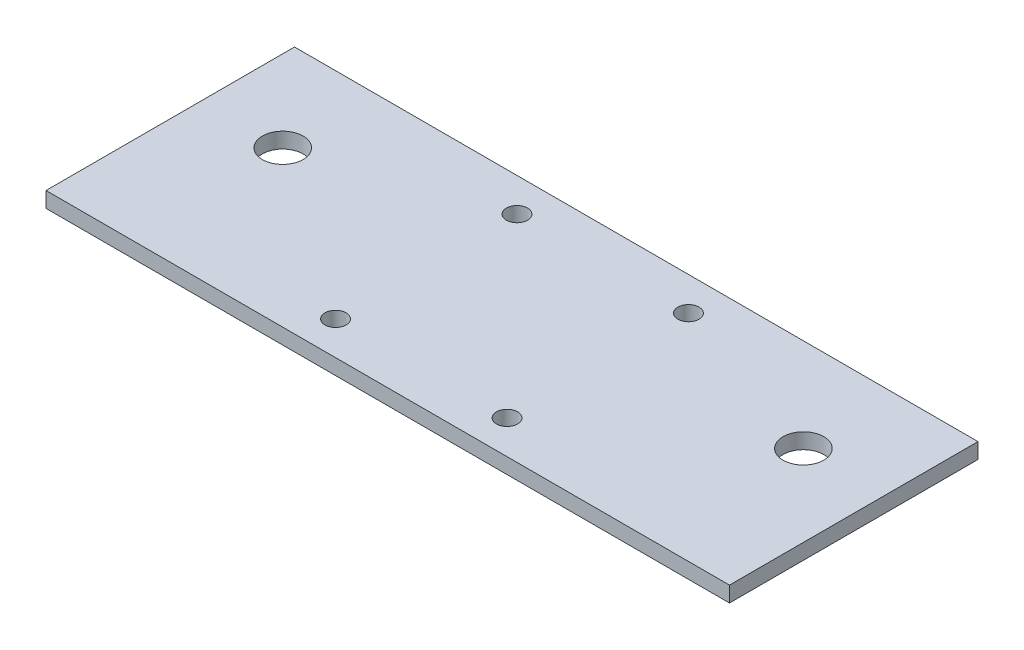
ISO-10303-21;
HEADER;
FILE_DESCRIPTION(('STEP AP214'),'2;1');
FILE_NAME('part.step','',(''),(''),'','','');
FILE_SCHEMA(('AUTOMOTIVE_DESIGN { 1 0 10303 214 1 1 1 1 }'));
ENDSEC;
DATA;
#1=APPLICATION_CONTEXT('core data for automotive mechanical design processes');
#2=APPLICATION_PROTOCOL_DEFINITION('international standard','automotive_design',2000,#1);
#3=PRODUCT_CONTEXT('',#1,'mechanical');
#4=PRODUCT('Part','Part','',(#3));
#5=PRODUCT_RELATED_PRODUCT_CATEGORY('part','',(#4));
#6=PRODUCT_DEFINITION_FORMATION('','',#4);
#7=PRODUCT_DEFINITION_CONTEXT('part definition',#1,'design');
#8=PRODUCT_DEFINITION('design','',#6,#7);
#9=PRODUCT_DEFINITION_SHAPE('','',#8);
#10=(LENGTH_UNIT() NAMED_UNIT(*) SI_UNIT(.MILLI.,.METRE.));
#11=(NAMED_UNIT(*) PLANE_ANGLE_UNIT() SI_UNIT($,.RADIAN.));
#12=(NAMED_UNIT(*) SI_UNIT($,.STERADIAN.) SOLID_ANGLE_UNIT());
#13=UNCERTAINTY_MEASURE_WITH_UNIT(LENGTH_MEASURE(1.E-05),#10,'distance_accuracy_value','');
#14=(GEOMETRIC_REPRESENTATION_CONTEXT(3) GLOBAL_UNCERTAINTY_ASSIGNED_CONTEXT((#13)) GLOBAL_UNIT_ASSIGNED_CONTEXT((#10,
#11,#12)) REPRESENTATION_CONTEXT('',''));
#15=CARTESIAN_POINT('',(0.,0.,0.));
#16=DIRECTION('',(0.,0.,1.));
#17=DIRECTION('',(1.,0.,0.));
#18=AXIS2_PLACEMENT_3D('',#15,#16,#17);
#19=CARTESIAN_POINT('',(0.,3.175,0.));
#20=DIRECTION('',(0.,1.,0.));
#21=DIRECTION('',(0.,0.,1.));
#22=AXIS2_PLACEMENT_3D('',#19,#20,#21);
#23=PLANE('',#22);
#24=CARTESIAN_POINT('',(-35.687,3.175,12.192));
#25=DIRECTION('',(0.,1.,0.));
#26=DIRECTION('',(0.,0.,1.));
#27=AXIS2_PLACEMENT_3D('',#24,#25,#26);
#28=CIRCLE('',#27,4.1656);
#29=CARTESIAN_POINT('',(-35.687,3.175,16.3576));
#30=VERTEX_POINT('',#29);
#31=EDGE_CURVE('E137',#30,#30,#28,.T.);
#32=ORIENTED_EDGE('',*,*,#31,.F.);
#33=EDGE_LOOP('',(#32));
#34=FACE_BOUND('',#33,.T.);
#35=CARTESIAN_POINT('',(0.,3.175,37.084));
#36=DIRECTION('',(0.,1.,0.));
#37=DIRECTION('',(0.,0.,1.));
#38=AXIS2_PLACEMENT_3D('',#35,#36,#37);
#39=CIRCLE('',#38,2.159);
#40=CARTESIAN_POINT('',(0.,3.175,39.243));
#41=VERTEX_POINT('',#40);
#42=EDGE_CURVE('E125',#41,#41,#39,.T.);
#43=ORIENTED_EDGE('',*,*,#42,.F.);
#44=EDGE_LOOP('',(#43));
#45=FACE_BOUND('',#44,.T.);
#46=CARTESIAN_POINT('',(0.,3.175,0.));
#47=DIRECTION('',(0.,1.,0.));
#48=DIRECTION('',(0.,0.,1.));
#49=AXIS2_PLACEMENT_3D('',#46,#47,#48);
#50=CIRCLE('',#49,2.159);
#51=CARTESIAN_POINT('',(0.,3.175,2.159));
#52=VERTEX_POINT('',#51);
#53=EDGE_CURVE('E104',#52,#52,#50,.T.);
#54=ORIENTED_EDGE('',*,*,#53,.F.);
#55=EDGE_LOOP('',(#54));
#56=FACE_BOUND('',#55,.T.);
#57=DIRECTION('',(0.,0.,1.));
#58=VECTOR('',#57,1.);
#59=CARTESIAN_POINT('',(-52.324,3.175,-6.858));
#60=LINE('',#59,#58);
#61=CARTESIAN_POINT('',(-52.324,3.175,-6.858));
#62=VERTEX_POINT('',#61);
#63=CARTESIAN_POINT('',(-52.324,3.175,43.942));
#64=VERTEX_POINT('',#63);
#65=EDGE_CURVE('E89',#62,#64,#60,.T.);
#66=ORIENTED_EDGE('',*,*,#65,.T.);
#67=DIRECTION('',(1.,0.,0.));
#68=VECTOR('',#67,1.);
#69=CARTESIAN_POINT('',(-52.324,3.175,43.942));
#70=LINE('',#69,#68);
#71=CARTESIAN_POINT('',(87.376,3.175,43.942));
#72=VERTEX_POINT('',#71);
#73=EDGE_CURVE('E84',#64,#72,#70,.T.);
#74=ORIENTED_EDGE('',*,*,#73,.T.);
#75=DIRECTION('',(0.,0.,-1.));
#76=VECTOR('',#75,1.);
#77=CARTESIAN_POINT('',(87.376,3.175,-6.858));
#78=LINE('',#77,#76);
#79=CARTESIAN_POINT('',(87.376,3.175,-6.858));
#80=VERTEX_POINT('',#79);
#81=EDGE_CURVE('E87',#72,#80,#78,.T.);
#82=ORIENTED_EDGE('',*,*,#81,.T.);
#83=DIRECTION('',(-1.,0.,0.));
#84=VECTOR('',#83,1.);
#85=CARTESIAN_POINT('',(-52.324,3.175,-6.858));
#86=LINE('',#85,#84);
#87=EDGE_CURVE('E54',#80,#62,#86,.T.);
#88=ORIENTED_EDGE('',*,*,#87,.T.);
#89=EDGE_LOOP('',(#66,#74,#82,#88));
#90=FACE_BOUND('',#89,.T.);
#91=CARTESIAN_POINT('',(35.052,3.175,0.));
#92=DIRECTION('',(0.,1.,0.));
#93=DIRECTION('',(0.,0.,1.));
#94=AXIS2_PLACEMENT_3D('',#91,#92,#93);
#95=CIRCLE('',#94,2.159);
#96=CARTESIAN_POINT('',(35.052,3.175,2.159));
#97=VERTEX_POINT('',#96);
#98=EDGE_CURVE('E119',#97,#97,#95,.T.);
#99=ORIENTED_EDGE('',*,*,#98,.F.);
#100=EDGE_LOOP('',(#99));
#101=FACE_BOUND('',#100,.T.);
#102=CARTESIAN_POINT('',(35.052,3.175,37.084));
#103=DIRECTION('',(0.,1.,0.));
#104=DIRECTION('',(0.,0.,1.));
#105=AXIS2_PLACEMENT_3D('',#102,#103,#104);
#106=CIRCLE('',#105,2.159);
#107=CARTESIAN_POINT('',(35.052,3.175,39.243));
#108=VERTEX_POINT('',#107);
#109=EDGE_CURVE('E131',#108,#108,#106,.T.);
#110=ORIENTED_EDGE('',*,*,#109,.F.);
#111=EDGE_LOOP('',(#110));
#112=FACE_BOUND('',#111,.T.);
#113=CARTESIAN_POINT('',(70.739,3.175,12.192));
#114=DIRECTION('',(0.,1.,0.));
#115=DIRECTION('',(0.,0.,1.));
#116=AXIS2_PLACEMENT_3D('',#113,#114,#115);
#117=CIRCLE('',#116,4.1656);
#118=CARTESIAN_POINT('',(70.739,3.175,16.3576));
#119=VERTEX_POINT('',#118);
#120=EDGE_CURVE('E143',#119,#119,#117,.T.);
#121=ORIENTED_EDGE('',*,*,#120,.F.);
#122=EDGE_LOOP('',(#121));
#123=FACE_BOUND('',#122,.T.);
#124=ADVANCED_FACE('F37',(#34,#45,#56,#90,#101,#112,#123),#23,.T.);
#125=CARTESIAN_POINT('',(0.,0.,0.));
#126=DIRECTION('',(0.,1.,0.));
#127=DIRECTION('',(0.,0.,1.));
#128=AXIS2_PLACEMENT_3D('',#125,#126,#127);
#129=PLANE('',#128);
#130=DIRECTION('',(0.,0.,1.));
#131=VECTOR('',#130,1.);
#132=CARTESIAN_POINT('',(-52.324,0.,-6.858));
#133=LINE('',#132,#131);
#134=CARTESIAN_POINT('',(-52.324,0.,-6.858));
#135=VERTEX_POINT('',#134);
#136=CARTESIAN_POINT('',(-52.324,0.,43.942));
#137=VERTEX_POINT('',#136);
#138=EDGE_CURVE('E101',#135,#137,#133,.T.);
#139=ORIENTED_EDGE('',*,*,#138,.F.);
#140=DIRECTION('',(-1.,0.,0.));
#141=VECTOR('',#140,1.);
#142=CARTESIAN_POINT('',(-52.324,0.,-6.858));
#143=LINE('',#142,#141);
#144=CARTESIAN_POINT('',(87.376,0.,-6.858));
#145=VERTEX_POINT('',#144);
#146=EDGE_CURVE('E77',#145,#135,#143,.T.);
#147=ORIENTED_EDGE('',*,*,#146,.F.);
#148=DIRECTION('',(0.,0.,-1.));
#149=VECTOR('',#148,1.);
#150=CARTESIAN_POINT('',(87.376,0.,-6.858));
#151=LINE('',#150,#149);
#152=CARTESIAN_POINT('',(87.376,0.,43.942));
#153=VERTEX_POINT('',#152);
#154=EDGE_CURVE('E71',#153,#145,#151,.T.);
#155=ORIENTED_EDGE('',*,*,#154,.F.);
#156=DIRECTION('',(1.,0.,0.));
#157=VECTOR('',#156,1.);
#158=CARTESIAN_POINT('',(-52.324,0.,43.942));
#159=LINE('',#158,#157);
#160=EDGE_CURVE('E93',#137,#153,#159,.T.);
#161=ORIENTED_EDGE('',*,*,#160,.F.);
#162=EDGE_LOOP('',(#139,#147,#155,#161));
#163=FACE_BOUND('',#162,.T.);
#164=CARTESIAN_POINT('',(0.,0.,0.));
#165=DIRECTION('',(0.,1.,0.));
#166=DIRECTION('',(0.,0.,1.));
#167=AXIS2_PLACEMENT_3D('',#164,#165,#166);
#168=CIRCLE('',#167,2.159);
#169=CARTESIAN_POINT('',(0.,0.,2.159));
#170=VERTEX_POINT('',#169);
#171=EDGE_CURVE('E116',#170,#170,#168,.T.);
#172=ORIENTED_EDGE('',*,*,#171,.T.);
#173=EDGE_LOOP('',(#172));
#174=FACE_BOUND('',#173,.T.);
#175=CARTESIAN_POINT('',(35.052,0.,0.));
#176=DIRECTION('',(0.,1.,0.));
#177=DIRECTION('',(0.,0.,1.));
#178=AXIS2_PLACEMENT_3D('',#175,#176,#177);
#179=CIRCLE('',#178,2.159);
#180=CARTESIAN_POINT('',(35.052,0.,2.159));
#181=VERTEX_POINT('',#180);
#182=EDGE_CURVE('E122',#181,#181,#179,.T.);
#183=ORIENTED_EDGE('',*,*,#182,.T.);
#184=EDGE_LOOP('',(#183));
#185=FACE_BOUND('',#184,.T.);
#186=CARTESIAN_POINT('',(0.,0.,37.084));
#187=DIRECTION('',(0.,1.,0.));
#188=DIRECTION('',(0.,0.,1.));
#189=AXIS2_PLACEMENT_3D('',#186,#187,#188);
#190=CIRCLE('',#189,2.159);
#191=CARTESIAN_POINT('',(0.,0.,39.243));
#192=VERTEX_POINT('',#191);
#193=EDGE_CURVE('E128',#192,#192,#190,.T.);
#194=ORIENTED_EDGE('',*,*,#193,.T.);
#195=EDGE_LOOP('',(#194));
#196=FACE_BOUND('',#195,.T.);
#197=CARTESIAN_POINT('',(35.052,0.,37.084));
#198=DIRECTION('',(0.,1.,0.));
#199=DIRECTION('',(0.,0.,1.));
#200=AXIS2_PLACEMENT_3D('',#197,#198,#199);
#201=CIRCLE('',#200,2.159);
#202=CARTESIAN_POINT('',(35.052,0.,39.243));
#203=VERTEX_POINT('',#202);
#204=EDGE_CURVE('E134',#203,#203,#201,.T.);
#205=ORIENTED_EDGE('',*,*,#204,.T.);
#206=EDGE_LOOP('',(#205));
#207=FACE_BOUND('',#206,.T.);
#208=CARTESIAN_POINT('',(-35.687,0.,12.192));
#209=DIRECTION('',(0.,1.,0.));
#210=DIRECTION('',(0.,0.,1.));
#211=AXIS2_PLACEMENT_3D('',#208,#209,#210);
#212=CIRCLE('',#211,4.1656);
#213=CARTESIAN_POINT('',(-35.687,0.,16.3576));
#214=VERTEX_POINT('',#213);
#215=EDGE_CURVE('E140',#214,#214,#212,.T.);
#216=ORIENTED_EDGE('',*,*,#215,.T.);
#217=EDGE_LOOP('',(#216));
#218=FACE_BOUND('',#217,.T.);
#219=CARTESIAN_POINT('',(70.739,0.,12.192));
#220=DIRECTION('',(0.,1.,0.));
#221=DIRECTION('',(0.,0.,1.));
#222=AXIS2_PLACEMENT_3D('',#219,#220,#221);
#223=CIRCLE('',#222,4.1656);
#224=CARTESIAN_POINT('',(70.739,0.,16.3576));
#225=VERTEX_POINT('',#224);
#226=EDGE_CURVE('E146',#225,#225,#223,.T.);
#227=ORIENTED_EDGE('',*,*,#226,.T.);
#228=EDGE_LOOP('',(#227));
#229=FACE_BOUND('',#228,.T.);
#230=ADVANCED_FACE('F112',(#163,#174,#185,#196,#207,#218,#229),#129,.F.);
#231=CARTESIAN_POINT('',(-52.324,3.175,-6.858));
#232=DIRECTION('',(1.,0.,0.));
#233=DIRECTION('',(0.,0.,-1.));
#234=AXIS2_PLACEMENT_3D('',#231,#232,#233);
#235=PLANE('',#234);
#236=ORIENTED_EDGE('',*,*,#138,.T.);
#237=DIRECTION('',(0.,-1.,0.));
#238=VECTOR('',#237,1.);
#239=CARTESIAN_POINT('',(-52.324,3.175,43.942));
#240=LINE('',#239,#238);
#241=EDGE_CURVE('E11',#64,#137,#240,.T.);
#242=ORIENTED_EDGE('',*,*,#241,.F.);
#243=ORIENTED_EDGE('',*,*,#65,.F.);
#244=DIRECTION('',(0.,-1.,0.));
#245=VECTOR('',#244,1.);
#246=CARTESIAN_POINT('',(-52.324,3.175,-6.858));
#247=LINE('',#246,#245);
#248=EDGE_CURVE('E97',#62,#135,#247,.T.);
#249=ORIENTED_EDGE('',*,*,#248,.T.);
#250=EDGE_LOOP('',(#236,#242,#243,#249));
#251=FACE_BOUND('',#250,.T.);
#252=ADVANCED_FACE('F39',(#251),#235,.F.);
#253=CARTESIAN_POINT('',(-52.324,3.175,43.942));
#254=DIRECTION('',(0.,0.,-1.));
#255=DIRECTION('',(-1.,0.,0.));
#256=AXIS2_PLACEMENT_3D('',#253,#254,#255);
#257=PLANE('',#256);
#258=ORIENTED_EDGE('',*,*,#160,.T.);
#259=DIRECTION('',(0.,-1.,0.));
#260=VECTOR('',#259,1.);
#261=CARTESIAN_POINT('',(87.376,3.175,43.942));
#262=LINE('',#261,#260);
#263=EDGE_CURVE('E46',#72,#153,#262,.T.);
#264=ORIENTED_EDGE('',*,*,#263,.F.);
#265=ORIENTED_EDGE('',*,*,#73,.F.);
#266=ORIENTED_EDGE('',*,*,#241,.T.);
#267=EDGE_LOOP('',(#258,#264,#265,#266));
#268=FACE_BOUND('',#267,.T.);
#269=ADVANCED_FACE('F92',(#268),#257,.F.);
#270=CARTESIAN_POINT('',(87.376,3.175,-6.858));
#271=DIRECTION('',(-1.,0.,0.));
#272=DIRECTION('',(0.,0.,1.));
#273=AXIS2_PLACEMENT_3D('',#270,#271,#272);
#274=PLANE('',#273);
#275=ORIENTED_EDGE('',*,*,#154,.T.);
#276=DIRECTION('',(0.,-1.,0.));
#277=VECTOR('',#276,1.);
#278=CARTESIAN_POINT('',(87.376,3.175,-6.858));
#279=LINE('',#278,#277);
#280=EDGE_CURVE('E94',#80,#145,#279,.T.);
#281=ORIENTED_EDGE('',*,*,#280,.F.);
#282=ORIENTED_EDGE('',*,*,#81,.F.);
#283=ORIENTED_EDGE('',*,*,#263,.T.);
#284=EDGE_LOOP('',(#275,#281,#282,#283));
#285=FACE_BOUND('',#284,.T.);
#286=ADVANCED_FACE('F95',(#285),#274,.F.);
#287=CARTESIAN_POINT('',(-52.324,3.175,-6.858));
#288=DIRECTION('',(0.,0.,1.));
#289=DIRECTION('',(1.,0.,0.));
#290=AXIS2_PLACEMENT_3D('',#287,#288,#289);
#291=PLANE('',#290);
#292=ORIENTED_EDGE('',*,*,#146,.T.);
#293=ORIENTED_EDGE('',*,*,#248,.F.);
#294=ORIENTED_EDGE('',*,*,#87,.F.);
#295=ORIENTED_EDGE('',*,*,#280,.T.);
#296=EDGE_LOOP('',(#292,#293,#294,#295));
#297=FACE_BOUND('',#296,.T.);
#298=ADVANCED_FACE('F109',(#297),#291,.F.);
#299=CARTESIAN_POINT('',(0.,3.175,0.));
#300=DIRECTION('',(0.,-1.,0.));
#301=DIRECTION('',(0.,0.,-1.));
#302=AXIS2_PLACEMENT_3D('',#299,#300,#301);
#303=CYLINDRICAL_SURFACE('',#302,2.159);
#304=ORIENTED_EDGE('',*,*,#53,.T.);
#305=EDGE_LOOP('',(#304));
#306=FACE_BOUND('',#305,.T.);
#307=ORIENTED_EDGE('',*,*,#171,.F.);
#308=EDGE_LOOP('',(#307));
#309=FACE_BOUND('',#308,.T.);
#310=ADVANCED_FACE('F165',(#306,#309),#303,.F.);
#311=CARTESIAN_POINT('',(35.052,3.175,0.));
#312=DIRECTION('',(0.,-1.,0.));
#313=DIRECTION('',(0.,0.,-1.));
#314=AXIS2_PLACEMENT_3D('',#311,#312,#313);
#315=CYLINDRICAL_SURFACE('',#314,2.159);
#316=ORIENTED_EDGE('',*,*,#98,.T.);
#317=EDGE_LOOP('',(#316));
#318=FACE_BOUND('',#317,.T.);
#319=ORIENTED_EDGE('',*,*,#182,.F.);
#320=EDGE_LOOP('',(#319));
#321=FACE_BOUND('',#320,.T.);
#322=ADVANCED_FACE('F219',(#318,#321),#315,.F.);
#323=CARTESIAN_POINT('',(0.,3.175,37.084));
#324=DIRECTION('',(0.,-1.,0.));
#325=DIRECTION('',(0.,0.,-1.));
#326=AXIS2_PLACEMENT_3D('',#323,#324,#325);
#327=CYLINDRICAL_SURFACE('',#326,2.159);
#328=ORIENTED_EDGE('',*,*,#42,.T.);
#329=EDGE_LOOP('',(#328));
#330=FACE_BOUND('',#329,.T.);
#331=ORIENTED_EDGE('',*,*,#193,.F.);
#332=EDGE_LOOP('',(#331));
#333=FACE_BOUND('',#332,.T.);
#334=ADVANCED_FACE('F228',(#330,#333),#327,.F.);
#335=CARTESIAN_POINT('',(35.052,3.175,37.084));
#336=DIRECTION('',(0.,-1.,0.));
#337=DIRECTION('',(0.,0.,-1.));
#338=AXIS2_PLACEMENT_3D('',#335,#336,#337);
#339=CYLINDRICAL_SURFACE('',#338,2.159);
#340=ORIENTED_EDGE('',*,*,#109,.T.);
#341=EDGE_LOOP('',(#340));
#342=FACE_BOUND('',#341,.T.);
#343=ORIENTED_EDGE('',*,*,#204,.F.);
#344=EDGE_LOOP('',(#343));
#345=FACE_BOUND('',#344,.T.);
#346=ADVANCED_FACE('F237',(#342,#345),#339,.F.);
#347=CARTESIAN_POINT('',(-35.687,3.175,12.192));
#348=DIRECTION('',(0.,-1.,0.));
#349=DIRECTION('',(0.,0.,-1.));
#350=AXIS2_PLACEMENT_3D('',#347,#348,#349);
#351=CYLINDRICAL_SURFACE('',#350,4.1656);
#352=ORIENTED_EDGE('',*,*,#31,.T.);
#353=EDGE_LOOP('',(#352));
#354=FACE_BOUND('',#353,.T.);
#355=ORIENTED_EDGE('',*,*,#215,.F.);
#356=EDGE_LOOP('',(#355));
#357=FACE_BOUND('',#356,.T.);
#358=ADVANCED_FACE('F247',(#354,#357),#351,.F.);
#359=CARTESIAN_POINT('',(70.739,3.175,12.192));
#360=DIRECTION('',(0.,-1.,0.));
#361=DIRECTION('',(0.,0.,-1.));
#362=AXIS2_PLACEMENT_3D('',#359,#360,#361);
#363=CYLINDRICAL_SURFACE('',#362,4.1656);
#364=ORIENTED_EDGE('',*,*,#120,.T.);
#365=EDGE_LOOP('',(#364));
#366=FACE_BOUND('',#365,.T.);
#367=ORIENTED_EDGE('',*,*,#226,.F.);
#368=EDGE_LOOP('',(#367));
#369=FACE_BOUND('',#368,.T.);
#370=ADVANCED_FACE('F152',(#366,#369),#363,.F.);
#371=CLOSED_SHELL('',(#124,#230,#252,#269,#286,#298,#310,#322,#334,#346,#358,#370));
#372=MANIFOLD_SOLID_BREP('B2',#371);
#373=ADVANCED_BREP_SHAPE_REPRESENTATION('',(#18,#372),#14);
#374=SHAPE_DEFINITION_REPRESENTATION(#9,#373);
ENDSEC;
END-ISO-10303-21;
